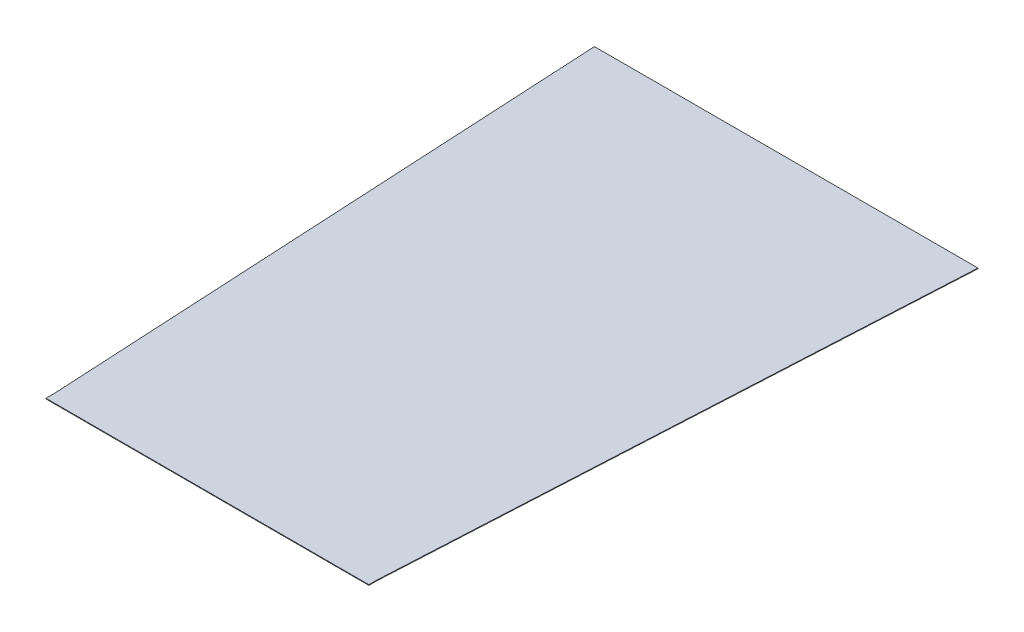
ISO-10303-21;
HEADER;
FILE_DESCRIPTION(('STEP AP214'),'2;1');
FILE_NAME('part.step','',(''),(''),'','','');
FILE_SCHEMA(('AUTOMOTIVE_DESIGN { 1 0 10303 214 1 1 1 1 }'));
ENDSEC;
DATA;
#1=APPLICATION_CONTEXT('core data for automotive mechanical design processes');
#2=APPLICATION_PROTOCOL_DEFINITION('international standard','automotive_design',2000,#1);
#3=PRODUCT_CONTEXT('',#1,'mechanical');
#4=PRODUCT('Part','Part','',(#3));
#5=PRODUCT_RELATED_PRODUCT_CATEGORY('part','',(#4));
#6=PRODUCT_DEFINITION_FORMATION('','',#4);
#7=PRODUCT_DEFINITION_CONTEXT('part definition',#1,'design');
#8=PRODUCT_DEFINITION('design','',#6,#7);
#9=PRODUCT_DEFINITION_SHAPE('','',#8);
#10=(LENGTH_UNIT() NAMED_UNIT(*) SI_UNIT(.MILLI.,.METRE.));
#11=(NAMED_UNIT(*) PLANE_ANGLE_UNIT() SI_UNIT($,.RADIAN.));
#12=(NAMED_UNIT(*) SI_UNIT($,.STERADIAN.) SOLID_ANGLE_UNIT());
#13=UNCERTAINTY_MEASURE_WITH_UNIT(LENGTH_MEASURE(1.E-05),#10,'distance_accuracy_value','');
#14=(GEOMETRIC_REPRESENTATION_CONTEXT(3) GLOBAL_UNCERTAINTY_ASSIGNED_CONTEXT((#13)) GLOBAL_UNIT_ASSIGNED_CONTEXT((#10,
#11,#12)) REPRESENTATION_CONTEXT('',''));
#15=CARTESIAN_POINT('',(0.,0.,0.));
#16=DIRECTION('',(0.,0.,1.));
#17=DIRECTION('',(1.,0.,0.));
#18=AXIS2_PLACEMENT_3D('',#15,#16,#17);
#19=CARTESIAN_POINT('',(-247.7,1.,0.));
#20=DIRECTION('',(1.,0.,0.));
#21=DIRECTION('',(0.,0.,-1.));
#22=AXIS2_PLACEMENT_3D('',#19,#20,#21);
#23=PLANE('',#22);
#24=DIRECTION('',(0.,0.,1.));
#25=VECTOR('',#24,1.);
#26=CARTESIAN_POINT('',(-247.7,0.,0.));
#27=LINE('',#26,#25);
#28=CARTESIAN_POINT('',(-247.7,0.,-12.02));
#29=VERTEX_POINT('',#28);
#30=CARTESIAN_POINT('',(-247.7,0.,0.));
#31=VERTEX_POINT('',#30);
#32=EDGE_CURVE('E128',#29,#31,#27,.T.);
#33=ORIENTED_EDGE('',*,*,#32,.T.);
#34=DIRECTION('',(0.,-1.,0.));
#35=VECTOR('',#34,1.);
#36=CARTESIAN_POINT('',(-247.7,1.,0.));
#37=LINE('',#36,#35);
#38=CARTESIAN_POINT('',(-247.7,1.,0.));
#39=VERTEX_POINT('',#38);
#40=EDGE_CURVE('E11',#39,#31,#37,.T.);
#41=ORIENTED_EDGE('',*,*,#40,.F.);
#42=DIRECTION('',(0.,0.,1.));
#43=VECTOR('',#42,1.);
#44=CARTESIAN_POINT('',(-247.7,1.,0.));
#45=LINE('',#44,#43);
#46=CARTESIAN_POINT('',(-247.7,1.,-12.02));
#47=VERTEX_POINT('',#46);
#48=EDGE_CURVE('E144',#47,#39,#45,.T.);
#49=ORIENTED_EDGE('',*,*,#48,.F.);
#50=DIRECTION('',(0.,-1.,0.));
#51=VECTOR('',#50,1.);
#52=CARTESIAN_POINT('',(-247.7,1.,-12.02));
#53=LINE('',#52,#51);
#54=EDGE_CURVE('E124',#47,#29,#53,.T.);
#55=ORIENTED_EDGE('',*,*,#54,.T.);
#56=EDGE_LOOP('',(#33,#41,#49,#55));
#57=FACE_BOUND('',#56,.T.);
#58=ADVANCED_FACE('F39',(#57),#23,.F.);
#59=CARTESIAN_POINT('',(-247.7,1.,0.));
#60=DIRECTION('',(0.,0.,-1.));
#61=DIRECTION('',(-1.,0.,0.));
#62=AXIS2_PLACEMENT_3D('',#59,#60,#61);
#63=PLANE('',#62);
#64=DIRECTION('',(1.,0.,0.));
#65=VECTOR('',#64,1.);
#66=CARTESIAN_POINT('',(-247.7,0.,0.));
#67=LINE('',#66,#65);
#68=CARTESIAN_POINT('',(247.7,0.,0.));
#69=VERTEX_POINT('',#68);
#70=EDGE_CURVE('E132',#31,#69,#67,.T.);
#71=ORIENTED_EDGE('',*,*,#70,.T.);
#72=DIRECTION('',(0.,-1.,0.));
#73=VECTOR('',#72,1.);
#74=CARTESIAN_POINT('',(247.7,1.,0.));
#75=LINE('',#74,#73);
#76=CARTESIAN_POINT('',(247.7,1.,0.));
#77=VERTEX_POINT('',#76);
#78=EDGE_CURVE('E48',#77,#69,#75,.T.);
#79=ORIENTED_EDGE('',*,*,#78,.F.);
#80=DIRECTION('',(1.,0.,0.));
#81=VECTOR('',#80,1.);
#82=CARTESIAN_POINT('',(-247.7,1.,0.));
#83=LINE('',#82,#81);
#84=EDGE_CURVE('E93',#39,#77,#83,.T.);
#85=ORIENTED_EDGE('',*,*,#84,.F.);
#86=ORIENTED_EDGE('',*,*,#40,.T.);
#87=EDGE_LOOP('',(#71,#79,#85,#86));
#88=FACE_BOUND('',#87,.T.);
#89=ADVANCED_FACE('F172',(#88),#63,.F.);
#90=CARTESIAN_POINT('',(247.7,1.,0.));
#91=DIRECTION('',(-1.,0.,0.));
#92=DIRECTION('',(0.,0.,1.));
#93=AXIS2_PLACEMENT_3D('',#90,#91,#92);
#94=PLANE('',#93);
#95=DIRECTION('',(0.,0.,-1.));
#96=VECTOR('',#95,1.);
#97=CARTESIAN_POINT('',(247.7,0.,0.));
#98=LINE('',#97,#96);
#99=CARTESIAN_POINT('',(247.7,0.,-12.02));
#100=VERTEX_POINT('',#99);
#101=EDGE_CURVE('E135',#69,#100,#98,.T.);
#102=ORIENTED_EDGE('',*,*,#101,.T.);
#103=DIRECTION('',(0.,-1.,0.));
#104=VECTOR('',#103,1.);
#105=CARTESIAN_POINT('',(247.7,1.,-12.02));
#106=LINE('',#105,#104);
#107=CARTESIAN_POINT('',(247.7,1.,-12.02));
#108=VERTEX_POINT('',#107);
#109=EDGE_CURVE('E117',#108,#100,#106,.T.);
#110=ORIENTED_EDGE('',*,*,#109,.F.);
#111=DIRECTION('',(0.,0.,-1.));
#112=VECTOR('',#111,1.);
#113=CARTESIAN_POINT('',(247.7,1.,0.));
#114=LINE('',#113,#112);
#115=EDGE_CURVE('E106',#77,#108,#114,.T.);
#116=ORIENTED_EDGE('',*,*,#115,.F.);
#117=ORIENTED_EDGE('',*,*,#78,.T.);
#118=EDGE_LOOP('',(#102,#110,#116,#117));
#119=FACE_BOUND('',#118,.T.);
#120=ADVANCED_FACE('F154',(#119),#94,.F.);
#121=CARTESIAN_POINT('',(247.7,1.,-12.02));
#122=DIRECTION('',(-0.998591440190546,0.,-0.0530578512396694));
#123=DIRECTION('',(-0.0530578512396694,0.,0.998591440190546));
#124=AXIS2_PLACEMENT_3D('',#121,#122,#123);
#125=PLANE('',#124);
#126=DIRECTION('',(0.0530578512396694,0.,-0.998591440190546));
#127=VECTOR('',#126,1.);
#128=CARTESIAN_POINT('',(247.7,0.,-12.02));
#129=LINE('',#128,#127);
#130=CARTESIAN_POINT('',(294.245,0.,-888.034340907157));
#131=VERTEX_POINT('',#130);
#132=EDGE_CURVE('E115',#100,#131,#129,.T.);
#133=ORIENTED_EDGE('',*,*,#132,.T.);
#134=DIRECTION('',(0.,-1.,0.));
#135=VECTOR('',#134,1.);
#136=CARTESIAN_POINT('',(294.245,1.,-888.034340907157));
#137=LINE('',#136,#135);
#138=CARTESIAN_POINT('',(294.245,1.,-888.034340907157));
#139=VERTEX_POINT('',#138);
#140=EDGE_CURVE('E112',#139,#131,#137,.T.);
#141=ORIENTED_EDGE('',*,*,#140,.F.);
#142=DIRECTION('',(0.0530578512396694,0.,-0.998591440190546));
#143=VECTOR('',#142,1.);
#144=CARTESIAN_POINT('',(247.7,1.,-12.02));
#145=LINE('',#144,#143);
#146=EDGE_CURVE('E100',#108,#139,#145,.T.);
#147=ORIENTED_EDGE('',*,*,#146,.F.);
#148=ORIENTED_EDGE('',*,*,#109,.T.);
#149=EDGE_LOOP('',(#133,#141,#147,#148));
#150=FACE_BOUND('',#149,.T.);
#151=ADVANCED_FACE('F113',(#150),#125,.F.);
#152=CARTESIAN_POINT('',(-294.245,1.,-888.034340907157));
#153=DIRECTION('',(0.,0.,1.));
#154=DIRECTION('',(1.,0.,0.));
#155=AXIS2_PLACEMENT_3D('',#152,#153,#154);
#156=PLANE('',#155);
#157=DIRECTION('',(-1.,0.,0.));
#158=VECTOR('',#157,1.);
#159=CARTESIAN_POINT('',(-294.245,0.,-888.034340907157));
#160=LINE('',#159,#158);
#161=CARTESIAN_POINT('',(-294.245,0.,-888.034340907157));
#162=VERTEX_POINT('',#161);
#163=EDGE_CURVE('E79',#131,#162,#160,.T.);
#164=ORIENTED_EDGE('',*,*,#163,.T.);
#165=DIRECTION('',(0.,-1.,0.));
#166=VECTOR('',#165,1.);
#167=CARTESIAN_POINT('',(-294.245,1.,-888.034340907157));
#168=LINE('',#167,#166);
#169=CARTESIAN_POINT('',(-294.245,1.,-888.034340907157));
#170=VERTEX_POINT('',#169);
#171=EDGE_CURVE('E118',#170,#162,#168,.T.);
#172=ORIENTED_EDGE('',*,*,#171,.F.);
#173=DIRECTION('',(-1.,0.,0.));
#174=VECTOR('',#173,1.);
#175=CARTESIAN_POINT('',(-294.245,1.,-888.034340907157));
#176=LINE('',#175,#174);
#177=EDGE_CURVE('E104',#139,#170,#176,.T.);
#178=ORIENTED_EDGE('',*,*,#177,.F.);
#179=ORIENTED_EDGE('',*,*,#140,.T.);
#180=EDGE_LOOP('',(#164,#172,#178,#179));
#181=FACE_BOUND('',#180,.T.);
#182=ADVANCED_FACE('F120',(#181),#156,.F.);
#183=CARTESIAN_POINT('',(-247.7,1.,-12.02));
#184=DIRECTION('',(0.998591440190546,0.,-0.0530578512396694));
#185=DIRECTION('',(-0.0530578512396694,0.,-0.998591440190546));
#186=AXIS2_PLACEMENT_3D('',#183,#184,#185);
#187=PLANE('',#186);
#188=DIRECTION('',(0.0530578512396694,0.,0.998591440190546));
#189=VECTOR('',#188,1.);
#190=CARTESIAN_POINT('',(-247.7,0.,-12.02));
#191=LINE('',#190,#189);
#192=EDGE_CURVE('E85',#162,#29,#191,.T.);
#193=ORIENTED_EDGE('',*,*,#192,.T.);
#194=ORIENTED_EDGE('',*,*,#54,.F.);
#195=DIRECTION('',(0.0530578512396694,0.,0.998591440190546));
#196=VECTOR('',#195,1.);
#197=CARTESIAN_POINT('',(-247.7,1.,-12.02));
#198=LINE('',#197,#196);
#199=EDGE_CURVE('E56',#170,#47,#198,.T.);
#200=ORIENTED_EDGE('',*,*,#199,.F.);
#201=ORIENTED_EDGE('',*,*,#171,.T.);
#202=EDGE_LOOP('',(#193,#194,#200,#201));
#203=FACE_BOUND('',#202,.T.);
#204=ADVANCED_FACE('F161',(#203),#187,.F.);
#205=CARTESIAN_POINT('',(0.,1.,0.));
#206=DIRECTION('',(0.,-1.,0.));
#207=DIRECTION('',(0.,0.,-1.));
#208=AXIS2_PLACEMENT_3D('',#205,#206,#207);
#209=PLANE('',#208);
#210=ORIENTED_EDGE('',*,*,#48,.T.);
#211=ORIENTED_EDGE('',*,*,#84,.T.);
#212=ORIENTED_EDGE('',*,*,#115,.T.);
#213=ORIENTED_EDGE('',*,*,#146,.T.);
#214=ORIENTED_EDGE('',*,*,#177,.T.);
#215=ORIENTED_EDGE('',*,*,#199,.T.);
#216=EDGE_LOOP('',(#210,#211,#212,#213,#214,#215));
#217=FACE_BOUND('',#216,.T.);
#218=ADVANCED_FACE('F102',(#217),#209,.F.);
#219=CARTESIAN_POINT('',(0.,0.,0.));
#220=DIRECTION('',(0.,-1.,0.));
#221=DIRECTION('',(0.,0.,-1.));
#222=AXIS2_PLACEMENT_3D('',#219,#220,#221);
#223=PLANE('',#222);
#224=ORIENTED_EDGE('',*,*,#32,.F.);
#225=ORIENTED_EDGE('',*,*,#192,.F.);
#226=ORIENTED_EDGE('',*,*,#163,.F.);
#227=ORIENTED_EDGE('',*,*,#132,.F.);
#228=ORIENTED_EDGE('',*,*,#101,.F.);
#229=ORIENTED_EDGE('',*,*,#70,.F.);
#230=EDGE_LOOP('',(#224,#225,#226,#227,#228,#229));
#231=FACE_BOUND('',#230,.T.);
#232=ADVANCED_FACE('F157',(#231),#223,.T.);
#233=CLOSED_SHELL('',(#58,#89,#120,#151,#182,#204,#218,#232));
#234=MANIFOLD_SOLID_BREP('B2',#233);
#235=ADVANCED_BREP_SHAPE_REPRESENTATION('',(#18,#234),#14);
#236=SHAPE_DEFINITION_REPRESENTATION(#9,#235);
ENDSEC;
END-ISO-10303-21;
